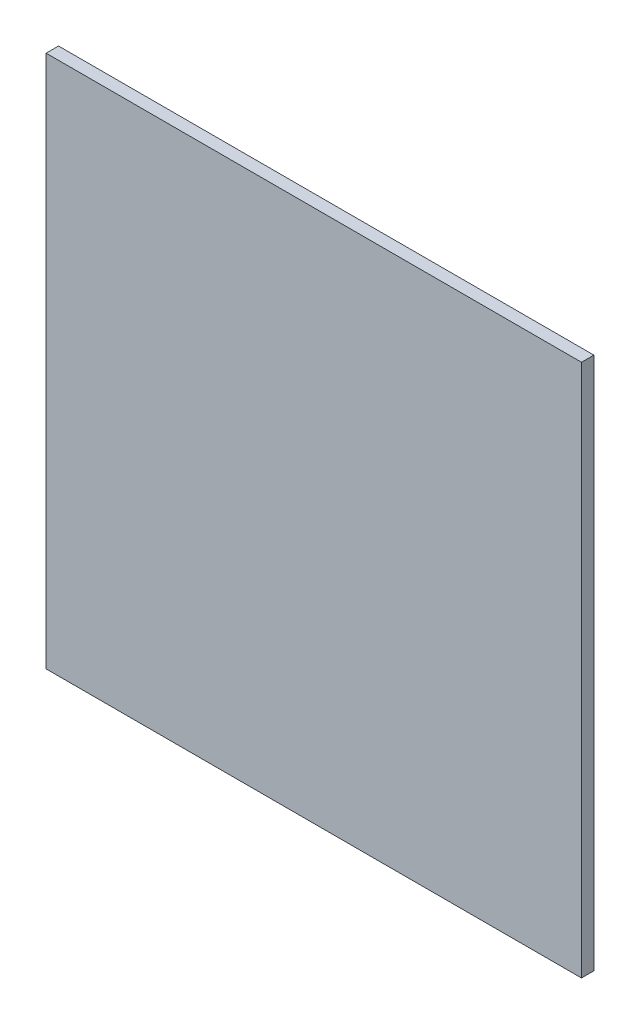
ISO-10303-21;
HEADER;
FILE_DESCRIPTION(('STEP AP214'),'2;1');
FILE_NAME('part.step','',(''),(''),'','','');
FILE_SCHEMA(('AUTOMOTIVE_DESIGN { 1 0 10303 214 1 1 1 1 }'));
ENDSEC;
DATA;
#1=APPLICATION_CONTEXT('core data for automotive mechanical design processes');
#2=APPLICATION_PROTOCOL_DEFINITION('international standard','automotive_design',2000,#1);
#3=PRODUCT_CONTEXT('',#1,'mechanical');
#4=PRODUCT('Part','Part','',(#3));
#5=PRODUCT_RELATED_PRODUCT_CATEGORY('part','',(#4));
#6=PRODUCT_DEFINITION_FORMATION('','',#4);
#7=PRODUCT_DEFINITION_CONTEXT('part definition',#1,'design');
#8=PRODUCT_DEFINITION('design','',#6,#7);
#9=PRODUCT_DEFINITION_SHAPE('','',#8);
#10=(LENGTH_UNIT() NAMED_UNIT(*) SI_UNIT(.MILLI.,.METRE.));
#11=(NAMED_UNIT(*) PLANE_ANGLE_UNIT() SI_UNIT($,.RADIAN.));
#12=(NAMED_UNIT(*) SI_UNIT($,.STERADIAN.) SOLID_ANGLE_UNIT());
#13=UNCERTAINTY_MEASURE_WITH_UNIT(LENGTH_MEASURE(1.E-05),#10,'distance_accuracy_value','');
#14=(GEOMETRIC_REPRESENTATION_CONTEXT(3) GLOBAL_UNCERTAINTY_ASSIGNED_CONTEXT((#13)) GLOBAL_UNIT_ASSIGNED_CONTEXT((#10,
#11,#12)) REPRESENTATION_CONTEXT('',''));
#15=CARTESIAN_POINT('',(0.,0.,0.));
#16=DIRECTION('',(0.,0.,1.));
#17=DIRECTION('',(1.,0.,0.));
#18=AXIS2_PLACEMENT_3D('',#15,#16,#17);
#19=CARTESIAN_POINT('',(177.715680516899,904.990478213205,3.));
#20=DIRECTION('',(1.,0.,0.));
#21=DIRECTION('',(0.,0.,-1.));
#22=AXIS2_PLACEMENT_3D('',#19,#20,#21);
#23=PLANE('',#22);
#24=DIRECTION('',(0.,-1.,0.));
#25=VECTOR('',#24,1.);
#26=CARTESIAN_POINT('',(177.715680516899,904.990478213205,0.));
#27=LINE('',#26,#25);
#28=CARTESIAN_POINT('',(177.715680516899,1034.02247821321,0.));
#29=VERTEX_POINT('',#28);
#30=CARTESIAN_POINT('',(177.715680516899,904.990478213205,0.));
#31=VERTEX_POINT('',#30);
#32=EDGE_CURVE('E104',#29,#31,#27,.T.);
#33=ORIENTED_EDGE('',*,*,#32,.T.);
#34=DIRECTION('',(0.,0.,-1.));
#35=VECTOR('',#34,1.);
#36=CARTESIAN_POINT('',(177.715680516899,904.990478213205,3.));
#37=LINE('',#36,#35);
#38=CARTESIAN_POINT('',(177.715680516899,904.990478213205,3.));
#39=VERTEX_POINT('',#38);
#40=EDGE_CURVE('E11',#39,#31,#37,.T.);
#41=ORIENTED_EDGE('',*,*,#40,.F.);
#42=DIRECTION('',(0.,-1.,0.));
#43=VECTOR('',#42,1.);
#44=CARTESIAN_POINT('',(177.715680516899,904.990478213205,3.));
#45=LINE('',#44,#43);
#46=CARTESIAN_POINT('',(177.715680516899,1034.02247821321,3.));
#47=VERTEX_POINT('',#46);
#48=EDGE_CURVE('E92',#47,#39,#45,.T.);
#49=ORIENTED_EDGE('',*,*,#48,.F.);
#50=DIRECTION('',(0.,0.,-1.));
#51=VECTOR('',#50,1.);
#52=CARTESIAN_POINT('',(177.715680516899,1034.02247821321,3.));
#53=LINE('',#52,#51);
#54=EDGE_CURVE('E100',#47,#29,#53,.T.);
#55=ORIENTED_EDGE('',*,*,#54,.T.);
#56=EDGE_LOOP('',(#33,#41,#49,#55));
#57=FACE_BOUND('',#56,.T.);
#58=ADVANCED_FACE('F41',(#57),#23,.F.);
#59=CARTESIAN_POINT('',(307.255680516899,904.990478213205,3.));
#60=DIRECTION('',(0.,1.,0.));
#61=DIRECTION('',(0.,0.,1.));
#62=AXIS2_PLACEMENT_3D('',#59,#60,#61);
#63=PLANE('',#62);
#64=DIRECTION('',(1.,0.,0.));
#65=VECTOR('',#64,1.);
#66=CARTESIAN_POINT('',(307.255680516899,904.990478213205,0.));
#67=LINE('',#66,#65);
#68=CARTESIAN_POINT('',(307.255680516899,904.990478213205,0.));
#69=VERTEX_POINT('',#68);
#70=EDGE_CURVE('E96',#31,#69,#67,.T.);
#71=ORIENTED_EDGE('',*,*,#70,.T.);
#72=DIRECTION('',(0.,0.,-1.));
#73=VECTOR('',#72,1.);
#74=CARTESIAN_POINT('',(307.255680516899,904.990478213205,3.));
#75=LINE('',#74,#73);
#76=CARTESIAN_POINT('',(307.255680516899,904.990478213205,3.));
#77=VERTEX_POINT('',#76);
#78=EDGE_CURVE('E49',#77,#69,#75,.T.);
#79=ORIENTED_EDGE('',*,*,#78,.F.);
#80=DIRECTION('',(1.,0.,0.));
#81=VECTOR('',#80,1.);
#82=CARTESIAN_POINT('',(307.255680516899,904.990478213205,3.));
#83=LINE('',#82,#81);
#84=EDGE_CURVE('E87',#39,#77,#83,.T.);
#85=ORIENTED_EDGE('',*,*,#84,.F.);
#86=ORIENTED_EDGE('',*,*,#40,.T.);
#87=EDGE_LOOP('',(#71,#79,#85,#86));
#88=FACE_BOUND('',#87,.T.);
#89=ADVANCED_FACE('F95',(#88),#63,.F.);
#90=CARTESIAN_POINT('',(307.255680516899,1034.02247821321,3.));
#91=DIRECTION('',(-1.,0.,0.));
#92=DIRECTION('',(0.,0.,1.));
#93=AXIS2_PLACEMENT_3D('',#90,#91,#92);
#94=PLANE('',#93);
#95=DIRECTION('',(0.,1.,0.));
#96=VECTOR('',#95,1.);
#97=CARTESIAN_POINT('',(307.255680516899,1034.02247821321,0.));
#98=LINE('',#97,#96);
#99=CARTESIAN_POINT('',(307.255680516899,1034.02247821321,0.));
#100=VERTEX_POINT('',#99);
#101=EDGE_CURVE('E74',#69,#100,#98,.T.);
#102=ORIENTED_EDGE('',*,*,#101,.T.);
#103=DIRECTION('',(0.,0.,-1.));
#104=VECTOR('',#103,1.);
#105=CARTESIAN_POINT('',(307.255680516899,1034.02247821321,3.));
#106=LINE('',#105,#104);
#107=CARTESIAN_POINT('',(307.255680516899,1034.02247821321,3.));
#108=VERTEX_POINT('',#107);
#109=EDGE_CURVE('E97',#108,#100,#106,.T.);
#110=ORIENTED_EDGE('',*,*,#109,.F.);
#111=DIRECTION('',(0.,1.,0.));
#112=VECTOR('',#111,1.);
#113=CARTESIAN_POINT('',(307.255680516899,1034.02247821321,3.));
#114=LINE('',#113,#112);
#115=EDGE_CURVE('E90',#77,#108,#114,.T.);
#116=ORIENTED_EDGE('',*,*,#115,.F.);
#117=ORIENTED_EDGE('',*,*,#78,.T.);
#118=EDGE_LOOP('',(#102,#110,#116,#117));
#119=FACE_BOUND('',#118,.T.);
#120=ADVANCED_FACE('F98',(#119),#94,.F.);
#121=CARTESIAN_POINT('',(177.715680516899,1034.02247821321,3.));
#122=DIRECTION('',(0.,-1.,0.));
#123=DIRECTION('',(0.,0.,-1.));
#124=AXIS2_PLACEMENT_3D('',#121,#122,#123);
#125=PLANE('',#124);
#126=DIRECTION('',(-1.,0.,0.));
#127=VECTOR('',#126,1.);
#128=CARTESIAN_POINT('',(177.715680516899,1034.02247821321,0.));
#129=LINE('',#128,#127);
#130=EDGE_CURVE('E80',#100,#29,#129,.T.);
#131=ORIENTED_EDGE('',*,*,#130,.T.);
#132=ORIENTED_EDGE('',*,*,#54,.F.);
#133=DIRECTION('',(-1.,0.,0.));
#134=VECTOR('',#133,1.);
#135=CARTESIAN_POINT('',(177.715680516899,1034.02247821321,3.));
#136=LINE('',#135,#134);
#137=EDGE_CURVE('E57',#108,#47,#136,.T.);
#138=ORIENTED_EDGE('',*,*,#137,.F.);
#139=ORIENTED_EDGE('',*,*,#109,.T.);
#140=EDGE_LOOP('',(#131,#132,#138,#139));
#141=FACE_BOUND('',#140,.T.);
#142=ADVANCED_FACE('F111',(#141),#125,.F.);
#143=CARTESIAN_POINT('',(0.,0.,3.));
#144=DIRECTION('',(0.,0.,-1.));
#145=DIRECTION('',(-1.,0.,0.));
#146=AXIS2_PLACEMENT_3D('',#143,#144,#145);
#147=PLANE('',#146);
#148=ORIENTED_EDGE('',*,*,#48,.T.);
#149=ORIENTED_EDGE('',*,*,#84,.T.);
#150=ORIENTED_EDGE('',*,*,#115,.T.);
#151=ORIENTED_EDGE('',*,*,#137,.T.);
#152=EDGE_LOOP('',(#148,#149,#150,#151));
#153=FACE_BOUND('',#152,.T.);
#154=ADVANCED_FACE('F88',(#153),#147,.F.);
#155=CARTESIAN_POINT('',(0.,0.,0.));
#156=DIRECTION('',(0.,0.,-1.));
#157=DIRECTION('',(-1.,0.,0.));
#158=AXIS2_PLACEMENT_3D('',#155,#156,#157);
#159=PLANE('',#158);
#160=ORIENTED_EDGE('',*,*,#32,.F.);
#161=ORIENTED_EDGE('',*,*,#130,.F.);
#162=ORIENTED_EDGE('',*,*,#101,.F.);
#163=ORIENTED_EDGE('',*,*,#70,.F.);
#164=EDGE_LOOP('',(#160,#161,#162,#163));
#165=FACE_BOUND('',#164,.T.);
#166=ADVANCED_FACE('F114',(#165),#159,.T.);
#167=CLOSED_SHELL('',(#58,#89,#120,#142,#154,#166));
#168=MANIFOLD_SOLID_BREP('B2',#167);
#169=ADVANCED_BREP_SHAPE_REPRESENTATION('',(#18,#168),#14);
#170=SHAPE_DEFINITION_REPRESENTATION(#9,#169);
ENDSEC;
END-ISO-10303-21;
